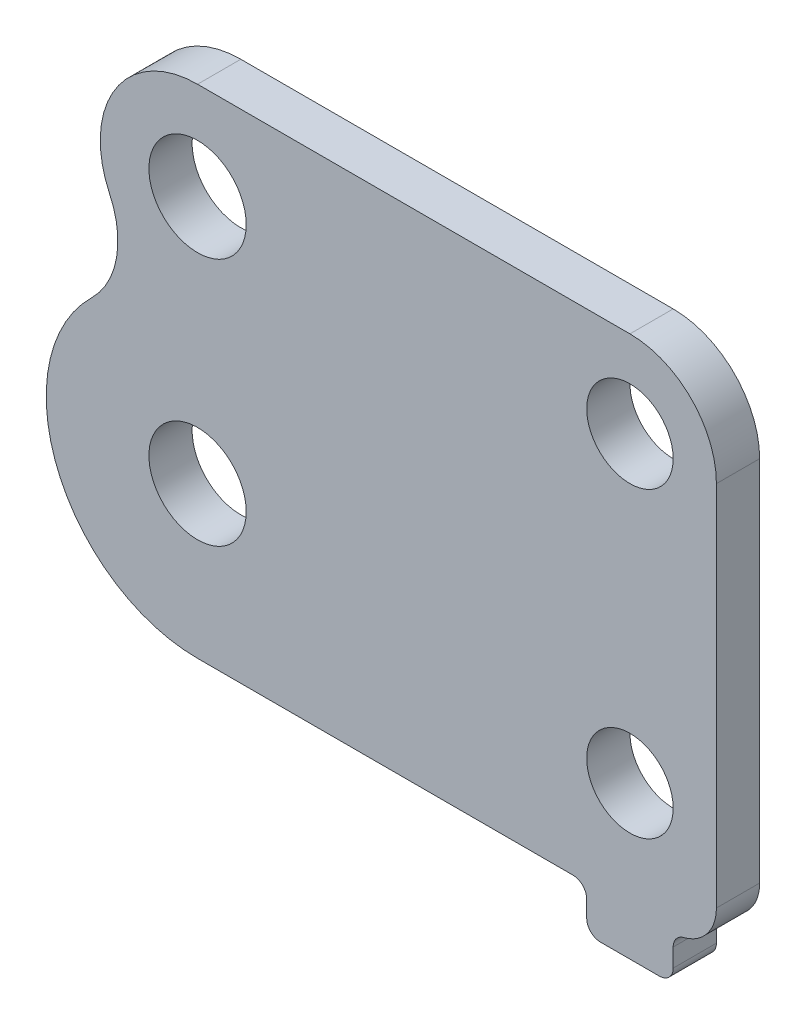
ISO-10303-21;
HEADER;
FILE_DESCRIPTION(('STEP AP214'),'2;1');
FILE_NAME('part.step','',(''),(''),'','','');
FILE_SCHEMA(('AUTOMOTIVE_DESIGN { 1 0 10303 214 1 1 1 1 }'));
ENDSEC;
DATA;
#1=APPLICATION_CONTEXT('core data for automotive mechanical design processes');
#2=APPLICATION_PROTOCOL_DEFINITION('international standard','automotive_design',2000,#1);
#3=PRODUCT_CONTEXT('',#1,'mechanical');
#4=PRODUCT('Part','Part','',(#3));
#5=PRODUCT_RELATED_PRODUCT_CATEGORY('part','',(#4));
#6=PRODUCT_DEFINITION_FORMATION('','',#4);
#7=PRODUCT_DEFINITION_CONTEXT('part definition',#1,'design');
#8=PRODUCT_DEFINITION('design','',#6,#7);
#9=PRODUCT_DEFINITION_SHAPE('','',#8);
#10=(LENGTH_UNIT() NAMED_UNIT(*) SI_UNIT(.MILLI.,.METRE.));
#11=(NAMED_UNIT(*) PLANE_ANGLE_UNIT() SI_UNIT($,.RADIAN.));
#12=(NAMED_UNIT(*) SI_UNIT($,.STERADIAN.) SOLID_ANGLE_UNIT());
#13=UNCERTAINTY_MEASURE_WITH_UNIT(LENGTH_MEASURE(1.E-05),#10,'distance_accuracy_value','');
#14=(GEOMETRIC_REPRESENTATION_CONTEXT(3) GLOBAL_UNCERTAINTY_ASSIGNED_CONTEXT((#13)) GLOBAL_UNIT_ASSIGNED_CONTEXT((#10,
#11,#12)) REPRESENTATION_CONTEXT('',''));
#15=CARTESIAN_POINT('',(0.,0.,0.));
#16=DIRECTION('',(0.,0.,1.));
#17=DIRECTION('',(1.,0.,0.));
#18=AXIS2_PLACEMENT_3D('',#15,#16,#17);
#19=CARTESIAN_POINT('',(0.,12.7,1.5875));
#20=DIRECTION('',(0.,1.,0.));
#21=DIRECTION('',(0.,0.,1.));
#22=AXIS2_PLACEMENT_3D('',#19,#20,#21);
#23=PLANE('',#22);
#24=DIRECTION('',(1.,0.,0.));
#25=VECTOR('',#24,1.);
#26=CARTESIAN_POINT('',(0.,12.7,1.5875));
#27=LINE('',#26,#25);
#28=CARTESIAN_POINT('',(0.,12.7,1.5875));
#29=VERTEX_POINT('',#28);
#30=CARTESIAN_POINT('',(15.875,12.7,1.5875));
#31=VERTEX_POINT('',#30);
#32=EDGE_CURVE('E155',#29,#31,#27,.T.);
#33=ORIENTED_EDGE('',*,*,#32,.T.);
#34=DIRECTION('',(0.,0.,-1.));
#35=VECTOR('',#34,1.);
#36=CARTESIAN_POINT('',(15.875,12.7,1.5875));
#37=LINE('',#36,#35);
#38=CARTESIAN_POINT('',(15.875,12.7,0.));
#39=VERTEX_POINT('',#38);
#40=EDGE_CURVE('E163',#31,#39,#37,.T.);
#41=ORIENTED_EDGE('',*,*,#40,.T.);
#42=DIRECTION('',(1.,0.,0.));
#43=VECTOR('',#42,1.);
#44=CARTESIAN_POINT('',(0.,12.7,0.));
#45=LINE('',#44,#43);
#46=CARTESIAN_POINT('',(0.,12.7,0.));
#47=VERTEX_POINT('',#46);
#48=EDGE_CURVE('E158',#47,#39,#45,.T.);
#49=ORIENTED_EDGE('',*,*,#48,.F.);
#50=DIRECTION('',(0.,0.,-1.));
#51=VECTOR('',#50,1.);
#52=CARTESIAN_POINT('',(0.,12.7,1.5875));
#53=LINE('',#52,#51);
#54=EDGE_CURVE('E151',#29,#47,#53,.T.);
#55=ORIENTED_EDGE('',*,*,#54,.F.);
#56=EDGE_LOOP('',(#33,#41,#49,#55));
#57=FACE_BOUND('',#56,.T.);
#58=ADVANCED_FACE('F41',(#57),#23,.T.);
#59=CARTESIAN_POINT('',(0.,9.128125,1.5875));
#60=DIRECTION('',(0.,0.,-1.));
#61=DIRECTION('',(-1.,0.,0.));
#62=AXIS2_PLACEMENT_3D('',#59,#60,#61);
#63=CYLINDRICAL_SURFACE('',#62,3.571875);
#64=CARTESIAN_POINT('',(0.,9.128125,0.));
#65=DIRECTION('',(0.,0.,1.));
#66=DIRECTION('',(1.,0.,0.));
#67=AXIS2_PLACEMENT_3D('',#64,#65,#66);
#68=CIRCLE('',#67,3.571875);
#69=CARTESIAN_POINT('',(-3.22968824866037,7.6025415601023,0.));
#70=VERTEX_POINT('',#69);
#71=EDGE_CURVE('E231',#47,#70,#68,.T.);
#72=ORIENTED_EDGE('',*,*,#71,.T.);
#73=DIRECTION('',(0.,0.,-1.));
#74=VECTOR('',#73,1.);
#75=CARTESIAN_POINT('',(-3.22968824866037,7.6025415601023,1.5875));
#76=LINE('',#75,#74);
#77=CARTESIAN_POINT('',(-3.22968824866037,7.6025415601023,1.5875));
#78=VERTEX_POINT('',#77);
#79=EDGE_CURVE('E164',#78,#70,#76,.T.);
#80=ORIENTED_EDGE('',*,*,#79,.F.);
#81=CARTESIAN_POINT('',(0.,9.128125,1.5875));
#82=DIRECTION('',(0.,0.,1.));
#83=DIRECTION('',(1.,0.,0.));
#84=AXIS2_PLACEMENT_3D('',#81,#82,#83);
#85=CIRCLE('',#84,3.571875);
#86=EDGE_CURVE('E167',#29,#78,#85,.T.);
#87=ORIENTED_EDGE('',*,*,#86,.F.);
#88=ORIENTED_EDGE('',*,*,#54,.T.);
#89=EDGE_LOOP('',(#72,#80,#87,#88));
#90=FACE_BOUND('',#89,.T.);
#91=ADVANCED_FACE('F168',(#90),#63,.T.);
#92=CARTESIAN_POINT('',(-6.10052224746959,6.24646739130435,1.5875));
#93=DIRECTION('',(0.,0.,-1.));
#94=DIRECTION('',(-1.,0.,0.));
#95=AXIS2_PLACEMENT_3D('',#92,#93,#94);
#96=CYLINDRICAL_SURFACE('',#95,3.175);
#97=CARTESIAN_POINT('',(-6.10052224746959,6.24646739130435,0.));
#98=DIRECTION('',(0.,0.,1.));
#99=DIRECTION('',(1.,0.,0.));
#100=AXIS2_PLACEMENT_3D('',#97,#98,#99);
#101=CIRCLE('',#100,3.175);
#102=CARTESIAN_POINT('',(-3.88215052111701,3.97502470355731,0.));
#103=VERTEX_POINT('',#102);
#104=EDGE_CURVE('E234',#103,#70,#101,.T.);
#105=ORIENTED_EDGE('',*,*,#104,.F.);
#106=DIRECTION('',(0.,0.,-1.));
#107=VECTOR('',#106,1.);
#108=CARTESIAN_POINT('',(-3.88215052111701,3.97502470355731,1.5875));
#109=LINE('',#108,#107);
#110=CARTESIAN_POINT('',(-3.88215052111701,3.97502470355731,1.5875));
#111=VERTEX_POINT('',#110);
#112=EDGE_CURVE('E274',#111,#103,#109,.T.);
#113=ORIENTED_EDGE('',*,*,#112,.F.);
#114=CARTESIAN_POINT('',(-6.10052224746959,6.24646739130435,1.5875));
#115=DIRECTION('',(0.,0.,1.));
#116=DIRECTION('',(1.,0.,0.));
#117=AXIS2_PLACEMENT_3D('',#114,#115,#116);
#118=CIRCLE('',#117,3.175);
#119=EDGE_CURVE('E173',#111,#78,#118,.T.);
#120=ORIENTED_EDGE('',*,*,#119,.T.);
#121=ORIENTED_EDGE('',*,*,#79,.T.);
#122=EDGE_LOOP('',(#105,#113,#120,#121));
#123=FACE_BOUND('',#122,.T.);
#124=ADVANCED_FACE('F400',(#123),#96,.F.);
#125=CARTESIAN_POINT('',(0.,0.,1.5875));
#126=DIRECTION('',(0.,0.,-1.));
#127=DIRECTION('',(-1.,0.,0.));
#128=AXIS2_PLACEMENT_3D('',#125,#126,#127);
#129=CYLINDRICAL_SURFACE('',#128,5.55625);
#130=CARTESIAN_POINT('',(0.,0.,0.));
#131=DIRECTION('',(0.,0.,1.));
#132=DIRECTION('',(1.,0.,0.));
#133=AXIS2_PLACEMENT_3D('',#130,#131,#132);
#134=CIRCLE('',#133,5.55625);
#135=CARTESIAN_POINT('',(0.,-5.55625,0.));
#136=VERTEX_POINT('',#135);
#137=EDGE_CURVE('E238',#103,#136,#134,.T.);
#138=ORIENTED_EDGE('',*,*,#137,.T.);
#139=DIRECTION('',(0.,0.,-1.));
#140=VECTOR('',#139,1.);
#141=CARTESIAN_POINT('',(0.,-5.55625,1.5875));
#142=LINE('',#141,#140);
#143=CARTESIAN_POINT('',(0.,-5.55625,1.5875));
#144=VERTEX_POINT('',#143);
#145=EDGE_CURVE('E228',#144,#136,#142,.T.);
#146=ORIENTED_EDGE('',*,*,#145,.F.);
#147=CARTESIAN_POINT('',(0.,0.,1.5875));
#148=DIRECTION('',(0.,0.,1.));
#149=DIRECTION('',(1.,0.,0.));
#150=AXIS2_PLACEMENT_3D('',#147,#148,#149);
#151=CIRCLE('',#150,5.55625);
#152=EDGE_CURVE('E190',#111,#144,#151,.T.);
#153=ORIENTED_EDGE('',*,*,#152,.F.);
#154=ORIENTED_EDGE('',*,*,#112,.T.);
#155=EDGE_LOOP('',(#138,#146,#153,#154));
#156=FACE_BOUND('',#155,.T.);
#157=ADVANCED_FACE('F405',(#156),#129,.T.);
#158=CARTESIAN_POINT('',(0.,-5.55625,1.5875));
#159=DIRECTION('',(0.,-1.,0.));
#160=DIRECTION('',(0.,0.,-1.));
#161=AXIS2_PLACEMENT_3D('',#158,#159,#160);
#162=PLANE('',#161);
#163=DIRECTION('',(-1.,0.,0.));
#164=VECTOR('',#163,1.);
#165=CARTESIAN_POINT('',(0.,-5.55625,0.));
#166=LINE('',#165,#164);
#167=CARTESIAN_POINT('',(13.7795,-5.55625,0.));
#168=VERTEX_POINT('',#167);
#169=EDGE_CURVE('E242',#168,#136,#166,.T.);
#170=ORIENTED_EDGE('',*,*,#169,.F.);
#171=DIRECTION('',(0.,0.,-1.));
#172=VECTOR('',#171,1.);
#173=CARTESIAN_POINT('',(13.7795,-5.55625,1.5875));
#174=LINE('',#173,#172);
#175=CARTESIAN_POINT('',(13.7795,-5.55625,1.5875));
#176=VERTEX_POINT('',#175);
#177=EDGE_CURVE('E57',#168,#176,#174,.F.);
#178=ORIENTED_EDGE('',*,*,#177,.T.);
#179=DIRECTION('',(-1.,0.,0.));
#180=VECTOR('',#179,1.);
#181=CARTESIAN_POINT('',(0.,-5.55625,1.5875));
#182=LINE('',#181,#180);
#183=EDGE_CURVE('E194',#176,#144,#182,.T.);
#184=ORIENTED_EDGE('',*,*,#183,.T.);
#185=ORIENTED_EDGE('',*,*,#145,.T.);
#186=EDGE_LOOP('',(#170,#178,#184,#185));
#187=FACE_BOUND('',#186,.T.);
#188=ADVANCED_FACE('F352',(#187),#162,.T.);
#189=CARTESIAN_POINT('',(14.2875,0.,1.5875));
#190=DIRECTION('',(1.,0.,0.));
#191=DIRECTION('',(0.,1.,0.));
#192=AXIS2_PLACEMENT_3D('',#189,#190,#191);
#193=PLANE('',#192);
#194=DIRECTION('',(0.,-1.,0.));
#195=VECTOR('',#194,1.);
#196=CARTESIAN_POINT('',(14.2875,0.,0.));
#197=LINE('',#196,#195);
#198=CARTESIAN_POINT('',(14.2875,-6.06425,0.));
#199=VERTEX_POINT('',#198);
#200=CARTESIAN_POINT('',(14.2875,-6.67385,0.));
#201=VERTEX_POINT('',#200);
#202=EDGE_CURVE('E245',#199,#201,#197,.T.);
#203=ORIENTED_EDGE('',*,*,#202,.T.);
#204=DIRECTION('',(0.,0.,-1.));
#205=VECTOR('',#204,1.);
#206=CARTESIAN_POINT('',(14.2875,-6.67385,1.5875));
#207=LINE('',#206,#205);
#208=CARTESIAN_POINT('',(14.2875,-6.67385,1.5875));
#209=VERTEX_POINT('',#208);
#210=EDGE_CURVE('E65',#201,#209,#207,.F.);
#211=ORIENTED_EDGE('',*,*,#210,.T.);
#212=DIRECTION('',(0.,-1.,0.));
#213=VECTOR('',#212,1.);
#214=CARTESIAN_POINT('',(14.2875,0.,1.5875));
#215=LINE('',#214,#213);
#216=CARTESIAN_POINT('',(14.2875,-6.06425,1.5875));
#217=VERTEX_POINT('',#216);
#218=EDGE_CURVE('E197',#217,#209,#215,.T.);
#219=ORIENTED_EDGE('',*,*,#218,.F.);
#220=DIRECTION('',(0.,0.,-1.));
#221=VECTOR('',#220,1.);
#222=CARTESIAN_POINT('',(14.2875,-6.06425,1.5875));
#223=LINE('',#222,#221);
#224=EDGE_CURVE('E324',#217,#199,#223,.T.);
#225=ORIENTED_EDGE('',*,*,#224,.T.);
#226=EDGE_LOOP('',(#203,#211,#219,#225));
#227=FACE_BOUND('',#226,.T.);
#228=ADVANCED_FACE('F356',(#227),#193,.F.);
#229=CARTESIAN_POINT('',(0.,-7.18185,1.5875));
#230=DIRECTION('',(0.,1.,0.));
#231=DIRECTION('',(-1.,0.,0.));
#232=AXIS2_PLACEMENT_3D('',#229,#230,#231);
#233=PLANE('',#232);
#234=DIRECTION('',(1.,0.,0.));
#235=VECTOR('',#234,1.);
#236=CARTESIAN_POINT('',(0.,-7.18185,1.5875));
#237=LINE('',#236,#235);
#238=CARTESIAN_POINT('',(14.7955,-7.18185,1.5875));
#239=VERTEX_POINT('',#238);
#240=CARTESIAN_POINT('',(16.9545,-7.18185,1.5875));
#241=VERTEX_POINT('',#240);
#242=EDGE_CURVE('E200',#239,#241,#237,.T.);
#243=ORIENTED_EDGE('',*,*,#242,.F.);
#244=DIRECTION('',(0.,0.,-1.));
#245=VECTOR('',#244,1.);
#246=CARTESIAN_POINT('',(14.7955,-7.18185,1.5875));
#247=LINE('',#246,#245);
#248=CARTESIAN_POINT('',(14.7955,-7.18185,0.));
#249=VERTEX_POINT('',#248);
#250=EDGE_CURVE('E314',#239,#249,#247,.T.);
#251=ORIENTED_EDGE('',*,*,#250,.T.);
#252=DIRECTION('',(1.,0.,0.));
#253=VECTOR('',#252,1.);
#254=CARTESIAN_POINT('',(0.,-7.18185,0.));
#255=LINE('',#254,#253);
#256=CARTESIAN_POINT('',(16.9545,-7.18185,0.));
#257=VERTEX_POINT('',#256);
#258=EDGE_CURVE('E248',#249,#257,#255,.T.);
#259=ORIENTED_EDGE('',*,*,#258,.T.);
#260=DIRECTION('',(0.,0.,-1.));
#261=VECTOR('',#260,1.);
#262=CARTESIAN_POINT('',(16.9545,-7.18185,1.5875));
#263=LINE('',#262,#261);
#264=EDGE_CURVE('E311',#257,#241,#263,.F.);
#265=ORIENTED_EDGE('',*,*,#264,.T.);
#266=EDGE_LOOP('',(#243,#251,#259,#265));
#267=FACE_BOUND('',#266,.T.);
#268=ADVANCED_FACE('F363',(#267),#233,.F.);
#269=CARTESIAN_POINT('',(17.4625,0.,1.5875));
#270=DIRECTION('',(-1.,0.,0.));
#271=DIRECTION('',(0.,0.,1.));
#272=AXIS2_PLACEMENT_3D('',#269,#270,#271);
#273=PLANE('',#272);
#274=DIRECTION('',(0.,1.,0.));
#275=VECTOR('',#274,1.);
#276=CARTESIAN_POINT('',(17.4625,0.,0.));
#277=LINE('',#276,#275);
#278=CARTESIAN_POINT('',(17.4625,-6.67385,0.));
#279=VERTEX_POINT('',#278);
#280=CARTESIAN_POINT('',(17.4625,-6.00174194538493,0.));
#281=VERTEX_POINT('',#280);
#282=EDGE_CURVE('E252',#279,#281,#277,.T.);
#283=ORIENTED_EDGE('',*,*,#282,.T.);
#284=DIRECTION('',(0.,0.,-1.));
#285=VECTOR('',#284,1.);
#286=CARTESIAN_POINT('',(17.4625,-6.00174194538493,1.5875));
#287=LINE('',#286,#285);
#288=CARTESIAN_POINT('',(17.4625,-6.00174194538493,1.5875));
#289=VERTEX_POINT('',#288);
#290=EDGE_CURVE('E308',#281,#289,#287,.F.);
#291=ORIENTED_EDGE('',*,*,#290,.T.);
#292=DIRECTION('',(0.,1.,0.));
#293=VECTOR('',#292,1.);
#294=CARTESIAN_POINT('',(17.4625,0.,1.5875));
#295=LINE('',#294,#293);
#296=CARTESIAN_POINT('',(17.4625,-6.67385,1.5875));
#297=VERTEX_POINT('',#296);
#298=EDGE_CURVE('E204',#297,#289,#295,.T.);
#299=ORIENTED_EDGE('',*,*,#298,.F.);
#300=DIRECTION('',(0.,0.,-1.));
#301=VECTOR('',#300,1.);
#302=CARTESIAN_POINT('',(17.4625,-6.67385,1.5875));
#303=LINE('',#302,#301);
#304=EDGE_CURVE('E304',#297,#279,#303,.T.);
#305=ORIENTED_EDGE('',*,*,#304,.T.);
#306=EDGE_LOOP('',(#283,#291,#299,#305));
#307=FACE_BOUND('',#306,.T.);
#308=ADVANCED_FACE('F371',(#307),#273,.F.);
#309=CARTESIAN_POINT('',(0.,0.,1.5875));
#310=DIRECTION('',(0.,0.,-1.));
#311=DIRECTION('',(-1.,0.,0.));
#312=AXIS2_PLACEMENT_3D('',#309,#310,#311);
#313=CYLINDRICAL_SURFACE('',#312,1.7859375);
#314=CARTESIAN_POINT('',(0.,0.,1.5875));
#315=DIRECTION('',(0.,0.,1.));
#316=DIRECTION('',(1.,0.,0.));
#317=AXIS2_PLACEMENT_3D('',#314,#315,#316);
#318=CIRCLE('',#317,1.7859375);
#319=CARTESIAN_POINT('',(1.7859375,0.,1.5875));
#320=VERTEX_POINT('',#319);
#321=EDGE_CURVE('E220',#320,#320,#318,.T.);
#322=ORIENTED_EDGE('',*,*,#321,.T.);
#323=EDGE_LOOP('',(#322));
#324=FACE_BOUND('',#323,.T.);
#325=CARTESIAN_POINT('',(0.,0.,0.));
#326=DIRECTION('',(0.,0.,1.));
#327=DIRECTION('',(1.,0.,0.));
#328=AXIS2_PLACEMENT_3D('',#325,#326,#327);
#329=CIRCLE('',#328,1.7859375);
#330=CARTESIAN_POINT('',(1.7859375,0.,0.));
#331=VERTEX_POINT('',#330);
#332=EDGE_CURVE('E185',#331,#331,#329,.T.);
#333=ORIENTED_EDGE('',*,*,#332,.F.);
#334=EDGE_LOOP('',(#333));
#335=FACE_BOUND('',#334,.T.);
#336=ADVANCED_FACE('F416',(#324,#335),#313,.F.);
#337=CARTESIAN_POINT('',(15.875,9.525,1.5875));
#338=DIRECTION('',(0.,0.,-1.));
#339=DIRECTION('',(-1.,0.,0.));
#340=AXIS2_PLACEMENT_3D('',#337,#338,#339);
#341=CYLINDRICAL_SURFACE('',#340,1.5875);
#342=CARTESIAN_POINT('',(15.875,9.525,1.5875));
#343=DIRECTION('',(0.,0.,1.));
#344=DIRECTION('',(1.,0.,0.));
#345=AXIS2_PLACEMENT_3D('',#342,#343,#344);
#346=CIRCLE('',#345,1.5875);
#347=CARTESIAN_POINT('',(17.4625,9.525,1.5875));
#348=VERTEX_POINT('',#347);
#349=EDGE_CURVE('E216',#348,#348,#346,.T.);
#350=ORIENTED_EDGE('',*,*,#349,.T.);
#351=EDGE_LOOP('',(#350));
#352=FACE_BOUND('',#351,.T.);
#353=CARTESIAN_POINT('',(15.875,9.525,0.));
#354=DIRECTION('',(0.,0.,1.));
#355=DIRECTION('',(1.,0.,0.));
#356=AXIS2_PLACEMENT_3D('',#353,#354,#355);
#357=CIRCLE('',#356,1.5875);
#358=CARTESIAN_POINT('',(17.4625,9.525,0.));
#359=VERTEX_POINT('',#358);
#360=EDGE_CURVE('E264',#359,#359,#357,.T.);
#361=ORIENTED_EDGE('',*,*,#360,.F.);
#362=EDGE_LOOP('',(#361));
#363=FACE_BOUND('',#362,.T.);
#364=ADVANCED_FACE('F425',(#352,#363),#341,.F.);
#365=CARTESIAN_POINT('',(15.875,-1.5875,1.5875));
#366=DIRECTION('',(0.,0.,-1.));
#367=DIRECTION('',(-1.,0.,0.));
#368=AXIS2_PLACEMENT_3D('',#365,#366,#367);
#369=CYLINDRICAL_SURFACE('',#368,1.5875);
#370=CARTESIAN_POINT('',(15.875,-1.5875,1.5875));
#371=DIRECTION('',(0.,0.,1.));
#372=DIRECTION('',(1.,0.,0.));
#373=AXIS2_PLACEMENT_3D('',#370,#371,#372);
#374=CIRCLE('',#373,1.5875);
#375=CARTESIAN_POINT('',(17.4625,-1.5875,1.5875));
#376=VERTEX_POINT('',#375);
#377=EDGE_CURVE('E212',#376,#376,#374,.T.);
#378=ORIENTED_EDGE('',*,*,#377,.T.);
#379=EDGE_LOOP('',(#378));
#380=FACE_BOUND('',#379,.T.);
#381=CARTESIAN_POINT('',(15.875,-1.5875,0.));
#382=DIRECTION('',(0.,0.,1.));
#383=DIRECTION('',(1.,0.,0.));
#384=AXIS2_PLACEMENT_3D('',#381,#382,#383);
#385=CIRCLE('',#384,1.5875);
#386=CARTESIAN_POINT('',(17.4625,-1.5875,0.));
#387=VERTEX_POINT('',#386);
#388=EDGE_CURVE('E260',#387,#387,#385,.T.);
#389=ORIENTED_EDGE('',*,*,#388,.F.);
#390=EDGE_LOOP('',(#389));
#391=FACE_BOUND('',#390,.T.);
#392=ADVANCED_FACE('F422',(#380,#391),#369,.F.);
#393=CARTESIAN_POINT('',(19.05,0.,1.5875));
#394=DIRECTION('',(1.,0.,0.));
#395=DIRECTION('',(0.,0.,-1.));
#396=AXIS2_PLACEMENT_3D('',#393,#394,#395);
#397=PLANE('',#396);
#398=DIRECTION('',(0.,-1.,0.));
#399=VECTOR('',#398,1.);
#400=CARTESIAN_POINT('',(19.05,0.,1.5875));
#401=LINE('',#400,#399);
#402=CARTESIAN_POINT('',(19.05,9.525,1.5875));
#403=VERTEX_POINT('',#402);
#404=CARTESIAN_POINT('',(19.05,-3.96875,1.5875));
#405=VERTEX_POINT('',#404);
#406=EDGE_CURVE('E208',#403,#405,#401,.T.);
#407=ORIENTED_EDGE('',*,*,#406,.T.);
#408=DIRECTION('',(0.,0.,-1.));
#409=VECTOR('',#408,1.);
#410=CARTESIAN_POINT('',(19.05,-3.96875,1.5875));
#411=LINE('',#410,#409);
#412=CARTESIAN_POINT('',(19.05,-3.96875,0.));
#413=VERTEX_POINT('',#412);
#414=EDGE_CURVE('E289',#405,#413,#411,.T.);
#415=ORIENTED_EDGE('',*,*,#414,.T.);
#416=DIRECTION('',(0.,-1.,0.));
#417=VECTOR('',#416,1.);
#418=CARTESIAN_POINT('',(19.05,0.,0.));
#419=LINE('',#418,#417);
#420=CARTESIAN_POINT('',(19.05,9.525,0.));
#421=VERTEX_POINT('',#420);
#422=EDGE_CURVE('E256',#421,#413,#419,.T.);
#423=ORIENTED_EDGE('',*,*,#422,.F.);
#424=DIRECTION('',(0.,0.,-1.));
#425=VECTOR('',#424,1.);
#426=CARTESIAN_POINT('',(19.05,9.525,1.5875));
#427=LINE('',#426,#425);
#428=EDGE_CURVE('E284',#421,#403,#427,.F.);
#429=ORIENTED_EDGE('',*,*,#428,.T.);
#430=EDGE_LOOP('',(#407,#415,#423,#429));
#431=FACE_BOUND('',#430,.T.);
#432=ADVANCED_FACE('F383',(#431),#397,.T.);
#433=CARTESIAN_POINT('',(0.,9.128125,1.5875));
#434=DIRECTION('',(0.,0.,-1.));
#435=DIRECTION('',(-1.,0.,0.));
#436=AXIS2_PLACEMENT_3D('',#433,#434,#435);
#437=CYLINDRICAL_SURFACE('',#436,1.7859375);
#438=CARTESIAN_POINT('',(0.,9.128125,1.5875));
#439=DIRECTION('',(0.,0.,1.));
#440=DIRECTION('',(1.,0.,0.));
#441=AXIS2_PLACEMENT_3D('',#438,#439,#440);
#442=CIRCLE('',#441,1.7859375);
#443=CARTESIAN_POINT('',(1.7859375,9.128125,1.5875));
#444=VERTEX_POINT('',#443);
#445=EDGE_CURVE('E224',#444,#444,#442,.T.);
#446=ORIENTED_EDGE('',*,*,#445,.T.);
#447=EDGE_LOOP('',(#446));
#448=FACE_BOUND('',#447,.T.);
#449=CARTESIAN_POINT('',(0.,9.128125,0.));
#450=DIRECTION('',(0.,0.,1.));
#451=DIRECTION('',(1.,0.,0.));
#452=AXIS2_PLACEMENT_3D('',#449,#450,#451);
#453=CIRCLE('',#452,1.7859375);
#454=CARTESIAN_POINT('',(1.7859375,9.128125,0.));
#455=VERTEX_POINT('',#454);
#456=EDGE_CURVE('E181',#455,#455,#453,.T.);
#457=ORIENTED_EDGE('',*,*,#456,.F.);
#458=EDGE_LOOP('',(#457));
#459=FACE_BOUND('',#458,.T.);
#460=ADVANCED_FACE('F421',(#448,#459),#437,.F.);
#461=CARTESIAN_POINT('',(0.,0.,1.5875));
#462=DIRECTION('',(0.,0.,1.));
#463=DIRECTION('',(1.,0.,0.));
#464=AXIS2_PLACEMENT_3D('',#461,#462,#463);
#465=PLANE('',#464);
#466=ORIENTED_EDGE('',*,*,#218,.T.);
#467=CARTESIAN_POINT('',(14.7955,-6.67385,1.5875));
#468=DIRECTION('',(0.,0.,1.));
#469=DIRECTION('',(1.,0.,0.));
#470=AXIS2_PLACEMENT_3D('',#467,#468,#469);
#471=CIRCLE('',#470,0.508);
#472=EDGE_CURVE('E333',#209,#239,#471,.T.);
#473=ORIENTED_EDGE('',*,*,#472,.T.);
#474=ORIENTED_EDGE('',*,*,#242,.T.);
#475=CARTESIAN_POINT('',(16.9545,-6.67385,1.5875));
#476=DIRECTION('',(0.,0.,1.));
#477=DIRECTION('',(1.,0.,0.));
#478=AXIS2_PLACEMENT_3D('',#475,#476,#477);
#479=CIRCLE('',#478,0.508);
#480=EDGE_CURVE('E330',#241,#297,#479,.T.);
#481=ORIENTED_EDGE('',*,*,#480,.T.);
#482=ORIENTED_EDGE('',*,*,#298,.T.);
#483=CARTESIAN_POINT('',(17.9705,-6.00174194538493,1.5875));
#484=DIRECTION('',(0.,0.,1.));
#485=DIRECTION('',(1.,0.,0.));
#486=AXIS2_PLACEMENT_3D('',#483,#484,#485);
#487=CIRCLE('',#486,0.508);
#488=CARTESIAN_POINT('',(17.8473484848485,-5.5088954131704,1.5875));
#489=VERTEX_POINT('',#488);
#490=EDGE_CURVE('E341',#289,#489,#487,.F.);
#491=ORIENTED_EDGE('',*,*,#490,.T.);
#492=CARTESIAN_POINT('',(17.4625,-3.96875,1.5875));
#493=DIRECTION('',(0.,0.,1.));
#494=DIRECTION('',(1.,0.,0.));
#495=AXIS2_PLACEMENT_3D('',#492,#493,#494);
#496=CIRCLE('',#495,1.5875);
#497=EDGE_CURVE('E297',#489,#405,#496,.T.);
#498=ORIENTED_EDGE('',*,*,#497,.T.);
#499=ORIENTED_EDGE('',*,*,#406,.F.);
#500=CARTESIAN_POINT('',(15.875,9.525,1.5875));
#501=DIRECTION('',(0.,0.,1.));
#502=DIRECTION('',(1.,0.,0.));
#503=AXIS2_PLACEMENT_3D('',#500,#501,#502);
#504=CIRCLE('',#503,3.175);
#505=EDGE_CURVE('E179',#403,#31,#504,.T.);
#506=ORIENTED_EDGE('',*,*,#505,.T.);
#507=ORIENTED_EDGE('',*,*,#32,.F.);
#508=ORIENTED_EDGE('',*,*,#86,.T.);
#509=ORIENTED_EDGE('',*,*,#119,.F.);
#510=ORIENTED_EDGE('',*,*,#152,.T.);
#511=ORIENTED_EDGE('',*,*,#183,.F.);
#512=CARTESIAN_POINT('',(13.7795,-6.06425,1.5875));
#513=DIRECTION('',(0.,0.,1.));
#514=DIRECTION('',(1.,0.,0.));
#515=AXIS2_PLACEMENT_3D('',#512,#513,#514);
#516=CIRCLE('',#515,0.508);
#517=EDGE_CURVE('E11',#176,#217,#516,.F.);
#518=ORIENTED_EDGE('',*,*,#517,.T.);
#519=EDGE_LOOP('',(#466,#473,#474,#481,#482,#491,#498,#499,#506,#507,#508,#509,#510,#511,#518));
#520=FACE_BOUND('',#519,.T.);
#521=ORIENTED_EDGE('',*,*,#377,.F.);
#522=EDGE_LOOP('',(#521));
#523=FACE_BOUND('',#522,.T.);
#524=ORIENTED_EDGE('',*,*,#349,.F.);
#525=EDGE_LOOP('',(#524));
#526=FACE_BOUND('',#525,.T.);
#527=ORIENTED_EDGE('',*,*,#321,.F.);
#528=EDGE_LOOP('',(#527));
#529=FACE_BOUND('',#528,.T.);
#530=ORIENTED_EDGE('',*,*,#445,.F.);
#531=EDGE_LOOP('',(#530));
#532=FACE_BOUND('',#531,.T.);
#533=ADVANCED_FACE('F175',(#520,#523,#526,#529,#532),#465,.T.);
#534=CARTESIAN_POINT('',(0.,0.,0.));
#535=DIRECTION('',(0.,0.,1.));
#536=DIRECTION('',(1.,0.,0.));
#537=AXIS2_PLACEMENT_3D('',#534,#535,#536);
#538=PLANE('',#537);
#539=ORIENTED_EDGE('',*,*,#258,.F.);
#540=CARTESIAN_POINT('',(14.7955,-6.67385,0.));
#541=DIRECTION('',(0.,0.,1.));
#542=DIRECTION('',(1.,0.,0.));
#543=AXIS2_PLACEMENT_3D('',#540,#541,#542);
#544=CIRCLE('',#543,0.508);
#545=EDGE_CURVE('E321',#249,#201,#544,.F.);
#546=ORIENTED_EDGE('',*,*,#545,.T.);
#547=ORIENTED_EDGE('',*,*,#202,.F.);
#548=CARTESIAN_POINT('',(13.7795,-6.06425,0.));
#549=DIRECTION('',(0.,0.,1.));
#550=DIRECTION('',(1.,0.,0.));
#551=AXIS2_PLACEMENT_3D('',#548,#549,#550);
#552=CIRCLE('',#551,0.508);
#553=EDGE_CURVE('E50',#199,#168,#552,.T.);
#554=ORIENTED_EDGE('',*,*,#553,.T.);
#555=ORIENTED_EDGE('',*,*,#169,.T.);
#556=ORIENTED_EDGE('',*,*,#137,.F.);
#557=ORIENTED_EDGE('',*,*,#104,.T.);
#558=ORIENTED_EDGE('',*,*,#71,.F.);
#559=ORIENTED_EDGE('',*,*,#48,.T.);
#560=CARTESIAN_POINT('',(15.875,9.525,0.));
#561=DIRECTION('',(0.,0.,1.));
#562=DIRECTION('',(1.,0.,0.));
#563=AXIS2_PLACEMENT_3D('',#560,#561,#562);
#564=CIRCLE('',#563,3.175);
#565=EDGE_CURVE('E281',#39,#421,#564,.F.);
#566=ORIENTED_EDGE('',*,*,#565,.T.);
#567=ORIENTED_EDGE('',*,*,#422,.T.);
#568=CARTESIAN_POINT('',(17.4625,-3.96875,0.));
#569=DIRECTION('',(0.,0.,1.));
#570=DIRECTION('',(1.,0.,0.));
#571=AXIS2_PLACEMENT_3D('',#568,#569,#570);
#572=CIRCLE('',#571,1.5875);
#573=CARTESIAN_POINT('',(17.8473484848485,-5.5088954131704,0.));
#574=VERTEX_POINT('',#573);
#575=EDGE_CURVE('E293',#413,#574,#572,.F.);
#576=ORIENTED_EDGE('',*,*,#575,.T.);
#577=CARTESIAN_POINT('',(17.9705,-6.00174194538493,0.));
#578=DIRECTION('',(0.,0.,1.));
#579=DIRECTION('',(1.,0.,0.));
#580=AXIS2_PLACEMENT_3D('',#577,#578,#579);
#581=CIRCLE('',#580,0.508);
#582=EDGE_CURVE('E338',#574,#281,#581,.T.);
#583=ORIENTED_EDGE('',*,*,#582,.T.);
#584=ORIENTED_EDGE('',*,*,#282,.F.);
#585=CARTESIAN_POINT('',(16.9545,-6.67385,0.));
#586=DIRECTION('',(0.,0.,1.));
#587=DIRECTION('',(1.,0.,0.));
#588=AXIS2_PLACEMENT_3D('',#585,#586,#587);
#589=CIRCLE('',#588,0.508);
#590=EDGE_CURVE('E318',#279,#257,#589,.F.);
#591=ORIENTED_EDGE('',*,*,#590,.T.);
#592=EDGE_LOOP('',(#539,#546,#547,#554,#555,#556,#557,#558,#559,#566,#567,#576,#583,#584,#591));
#593=FACE_BOUND('',#592,.T.);
#594=ORIENTED_EDGE('',*,*,#388,.T.);
#595=EDGE_LOOP('',(#594));
#596=FACE_BOUND('',#595,.T.);
#597=ORIENTED_EDGE('',*,*,#360,.T.);
#598=EDGE_LOOP('',(#597));
#599=FACE_BOUND('',#598,.T.);
#600=ORIENTED_EDGE('',*,*,#332,.T.);
#601=EDGE_LOOP('',(#600));
#602=FACE_BOUND('',#601,.T.);
#603=ORIENTED_EDGE('',*,*,#456,.T.);
#604=EDGE_LOOP('',(#603));
#605=FACE_BOUND('',#604,.T.);
#606=ADVANCED_FACE('F347',(#593,#596,#599,#602,#605),#538,.F.);
#607=CARTESIAN_POINT('',(15.875,9.525,1.5875));
#608=DIRECTION('',(0.,0.,-1.));
#609=DIRECTION('',(-1.,0.,0.));
#610=AXIS2_PLACEMENT_3D('',#607,#608,#609);
#611=CYLINDRICAL_SURFACE('',#610,3.175);
#612=ORIENTED_EDGE('',*,*,#505,.F.);
#613=ORIENTED_EDGE('',*,*,#428,.F.);
#614=ORIENTED_EDGE('',*,*,#565,.F.);
#615=ORIENTED_EDGE('',*,*,#40,.F.);
#616=EDGE_LOOP('',(#612,#613,#614,#615));
#617=FACE_BOUND('',#616,.T.);
#618=ADVANCED_FACE('F386',(#617),#611,.T.);
#619=CARTESIAN_POINT('',(17.4625,-3.96875,1.5875));
#620=DIRECTION('',(0.,0.,-1.));
#621=DIRECTION('',(-1.,0.,0.));
#622=AXIS2_PLACEMENT_3D('',#619,#620,#621);
#623=CYLINDRICAL_SURFACE('',#622,1.5875);
#624=ORIENTED_EDGE('',*,*,#497,.F.);
#625=DIRECTION('',(0.,0.,-1.));
#626=VECTOR('',#625,1.);
#627=CARTESIAN_POINT('',(17.8473484848485,-5.5088954131704,1.5875));
#628=LINE('',#627,#626);
#629=EDGE_CURVE('E300',#489,#574,#628,.T.);
#630=ORIENTED_EDGE('',*,*,#629,.T.);
#631=ORIENTED_EDGE('',*,*,#575,.F.);
#632=ORIENTED_EDGE('',*,*,#414,.F.);
#633=EDGE_LOOP('',(#624,#630,#631,#632));
#634=FACE_BOUND('',#633,.T.);
#635=ADVANCED_FACE('F380',(#634),#623,.T.);
#636=CARTESIAN_POINT('',(17.9705,-6.00174194538493,1.5875));
#637=DIRECTION('',(0.,0.,-1.));
#638=DIRECTION('',(-1.,0.,0.));
#639=AXIS2_PLACEMENT_3D('',#636,#637,#638);
#640=CYLINDRICAL_SURFACE('',#639,0.508);
#641=ORIENTED_EDGE('',*,*,#490,.F.);
#642=ORIENTED_EDGE('',*,*,#290,.F.);
#643=ORIENTED_EDGE('',*,*,#582,.F.);
#644=ORIENTED_EDGE('',*,*,#629,.F.);
#645=EDGE_LOOP('',(#641,#642,#643,#644));
#646=FACE_BOUND('',#645,.T.);
#647=ADVANCED_FACE('F375',(#646),#640,.F.);
#648=CARTESIAN_POINT('',(14.7955,-6.67385,1.5875));
#649=DIRECTION('',(0.,0.,-1.));
#650=DIRECTION('',(-1.,0.,0.));
#651=AXIS2_PLACEMENT_3D('',#648,#649,#650);
#652=CYLINDRICAL_SURFACE('',#651,0.508);
#653=ORIENTED_EDGE('',*,*,#472,.F.);
#654=ORIENTED_EDGE('',*,*,#210,.F.);
#655=ORIENTED_EDGE('',*,*,#545,.F.);
#656=ORIENTED_EDGE('',*,*,#250,.F.);
#657=EDGE_LOOP('',(#653,#654,#655,#656));
#658=FACE_BOUND('',#657,.T.);
#659=ADVANCED_FACE('F358',(#658),#652,.T.);
#660=CARTESIAN_POINT('',(16.9545,-6.67385,1.5875));
#661=DIRECTION('',(0.,0.,-1.));
#662=DIRECTION('',(-1.,0.,0.));
#663=AXIS2_PLACEMENT_3D('',#660,#661,#662);
#664=CYLINDRICAL_SURFACE('',#663,0.508);
#665=ORIENTED_EDGE('',*,*,#480,.F.);
#666=ORIENTED_EDGE('',*,*,#264,.F.);
#667=ORIENTED_EDGE('',*,*,#590,.F.);
#668=ORIENTED_EDGE('',*,*,#304,.F.);
#669=EDGE_LOOP('',(#665,#666,#667,#668));
#670=FACE_BOUND('',#669,.T.);
#671=ADVANCED_FACE('F366',(#670),#664,.T.);
#672=CARTESIAN_POINT('',(13.7795,-6.06425,1.5875));
#673=DIRECTION('',(0.,0.,-1.));
#674=DIRECTION('',(-1.,0.,0.));
#675=AXIS2_PLACEMENT_3D('',#672,#673,#674);
#676=CYLINDRICAL_SURFACE('',#675,0.508);
#677=ORIENTED_EDGE('',*,*,#517,.F.);
#678=ORIENTED_EDGE('',*,*,#177,.F.);
#679=ORIENTED_EDGE('',*,*,#553,.F.);
#680=ORIENTED_EDGE('',*,*,#224,.F.);
#681=EDGE_LOOP('',(#677,#678,#679,#680));
#682=FACE_BOUND('',#681,.T.);
#683=ADVANCED_FACE('F43',(#682),#676,.F.);
#684=CLOSED_SHELL('',(#58,#91,#124,#157,#188,#228,#268,#308,#336,#364,#392,#432,#460,#533,#606,
#618,#635,#647,#659,#671,#683));
#685=MANIFOLD_SOLID_BREP('B2',#684);
#686=ADVANCED_BREP_SHAPE_REPRESENTATION('',(#18,#685),#14);
#687=SHAPE_DEFINITION_REPRESENTATION(#9,#686);
ENDSEC;
END-ISO-10303-21;
